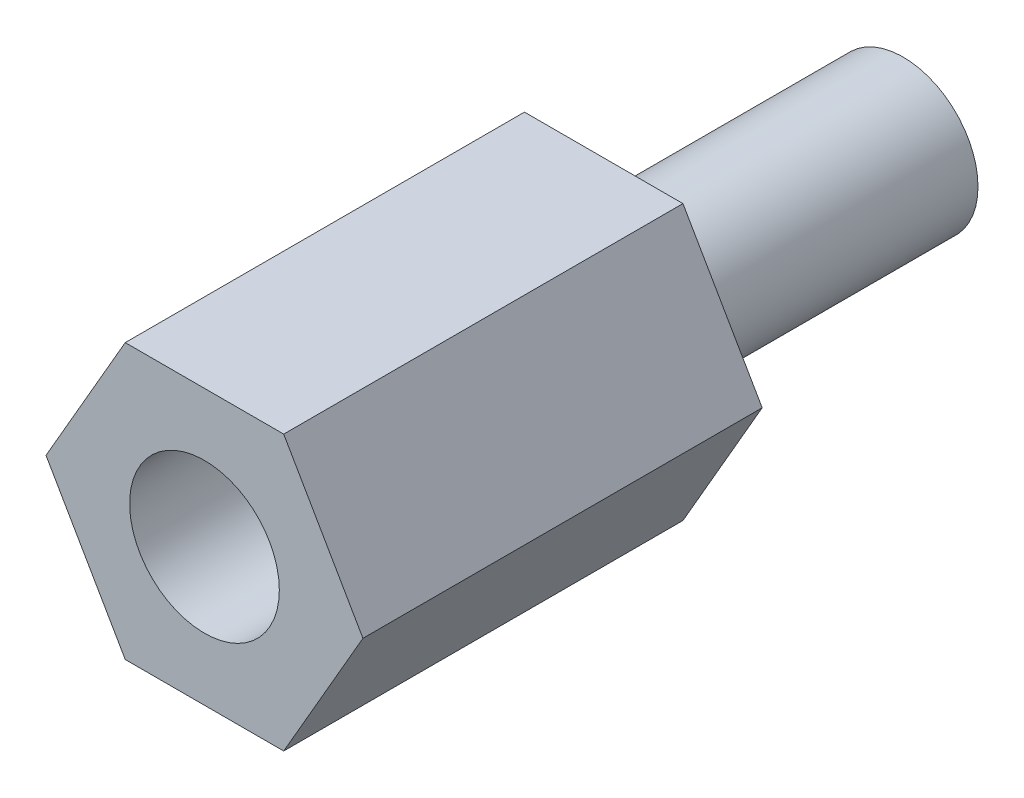
ISO-10303-21;
HEADER;
FILE_DESCRIPTION(('STEP AP214'),'2;1');
FILE_NAME('part.step','',(''),(''),'','','');
FILE_SCHEMA(('AUTOMOTIVE_DESIGN { 1 0 10303 214 1 1 1 1 }'));
ENDSEC;
DATA;
#1=APPLICATION_CONTEXT('core data for automotive mechanical design processes');
#2=APPLICATION_PROTOCOL_DEFINITION('international standard','automotive_design',2000,#1);
#3=PRODUCT_CONTEXT('',#1,'mechanical');
#4=PRODUCT('Part','Part','',(#3));
#5=PRODUCT_RELATED_PRODUCT_CATEGORY('part','',(#4));
#6=PRODUCT_DEFINITION_FORMATION('','',#4);
#7=PRODUCT_DEFINITION_CONTEXT('part definition',#1,'design');
#8=PRODUCT_DEFINITION('design','',#6,#7);
#9=PRODUCT_DEFINITION_SHAPE('','',#8);
#10=(LENGTH_UNIT() NAMED_UNIT(*) SI_UNIT(.MILLI.,.METRE.));
#11=(NAMED_UNIT(*) PLANE_ANGLE_UNIT() SI_UNIT($,.RADIAN.));
#12=(NAMED_UNIT(*) SI_UNIT($,.STERADIAN.) SOLID_ANGLE_UNIT());
#13=UNCERTAINTY_MEASURE_WITH_UNIT(LENGTH_MEASURE(1.E-05),#10,'distance_accuracy_value','');
#14=(GEOMETRIC_REPRESENTATION_CONTEXT(3) GLOBAL_UNCERTAINTY_ASSIGNED_CONTEXT((#13)) GLOBAL_UNIT_ASSIGNED_CONTEXT((#10,
#11,#12)) REPRESENTATION_CONTEXT('',''));
#15=CARTESIAN_POINT('',(0.,0.,0.));
#16=DIRECTION('',(0.,0.,1.));
#17=DIRECTION('',(1.,0.,0.));
#18=AXIS2_PLACEMENT_3D('',#15,#16,#17);
#19=CARTESIAN_POINT('',(3.17542648054294,0.,8.));
#20=DIRECTION('',(-0.866025403784439,-0.5,0.));
#21=DIRECTION('',(0.5,-0.866025403784439,0.));
#22=AXIS2_PLACEMENT_3D('',#19,#20,#21);
#23=PLANE('',#22);
#24=DIRECTION('',(-0.5,0.866025403784439,0.));
#25=VECTOR('',#24,1.);
#26=CARTESIAN_POINT('',(3.17542648054294,0.,0.));
#27=LINE('',#26,#25);
#28=CARTESIAN_POINT('',(3.17542648054294,0.,0.));
#29=VERTEX_POINT('',#28);
#30=CARTESIAN_POINT('',(1.58771324027147,2.75,0.));
#31=VERTEX_POINT('',#30);
#32=EDGE_CURVE('E133',#29,#31,#27,.T.);
#33=ORIENTED_EDGE('',*,*,#32,.T.);
#34=DIRECTION('',(0.,0.,-1.));
#35=VECTOR('',#34,1.);
#36=CARTESIAN_POINT('',(1.58771324027147,2.75,8.));
#37=LINE('',#36,#35);
#38=CARTESIAN_POINT('',(1.58771324027147,2.75,8.));
#39=VERTEX_POINT('',#38);
#40=EDGE_CURVE('E11',#39,#31,#37,.T.);
#41=ORIENTED_EDGE('',*,*,#40,.F.);
#42=DIRECTION('',(-0.5,0.866025403784439,0.));
#43=VECTOR('',#42,1.);
#44=CARTESIAN_POINT('',(3.17542648054294,0.,8.));
#45=LINE('',#44,#43);
#46=CARTESIAN_POINT('',(3.17542648054294,0.,8.));
#47=VERTEX_POINT('',#46);
#48=EDGE_CURVE('E151',#47,#39,#45,.T.);
#49=ORIENTED_EDGE('',*,*,#48,.F.);
#50=DIRECTION('',(0.,0.,-1.));
#51=VECTOR('',#50,1.);
#52=CARTESIAN_POINT('',(3.17542648054294,0.,8.));
#53=LINE('',#52,#51);
#54=EDGE_CURVE('E128',#47,#29,#53,.T.);
#55=ORIENTED_EDGE('',*,*,#54,.T.);
#56=EDGE_LOOP('',(#33,#41,#49,#55));
#57=FACE_BOUND('',#56,.T.);
#58=ADVANCED_FACE('F44',(#57),#23,.F.);
#59=CARTESIAN_POINT('',(1.58771324027147,2.75,8.));
#60=DIRECTION('',(0.,-1.,0.));
#61=DIRECTION('',(1.,0.,0.));
#62=AXIS2_PLACEMENT_3D('',#59,#60,#61);
#63=PLANE('',#62);
#64=DIRECTION('',(-1.,0.,0.));
#65=VECTOR('',#64,1.);
#66=CARTESIAN_POINT('',(1.58771324027147,2.75,0.));
#67=LINE('',#66,#65);
#68=CARTESIAN_POINT('',(-1.58771324027147,2.75,0.));
#69=VERTEX_POINT('',#68);
#70=EDGE_CURVE('E138',#31,#69,#67,.T.);
#71=ORIENTED_EDGE('',*,*,#70,.T.);
#72=DIRECTION('',(0.,0.,-1.));
#73=VECTOR('',#72,1.);
#74=CARTESIAN_POINT('',(-1.58771324027147,2.75,8.));
#75=LINE('',#74,#73);
#76=CARTESIAN_POINT('',(-1.58771324027147,2.75,8.));
#77=VERTEX_POINT('',#76);
#78=EDGE_CURVE('E53',#77,#69,#75,.T.);
#79=ORIENTED_EDGE('',*,*,#78,.F.);
#80=DIRECTION('',(-1.,0.,0.));
#81=VECTOR('',#80,1.);
#82=CARTESIAN_POINT('',(1.58771324027147,2.75,8.));
#83=LINE('',#82,#81);
#84=EDGE_CURVE('E97',#39,#77,#83,.T.);
#85=ORIENTED_EDGE('',*,*,#84,.F.);
#86=ORIENTED_EDGE('',*,*,#40,.T.);
#87=EDGE_LOOP('',(#71,#79,#85,#86));
#88=FACE_BOUND('',#87,.T.);
#89=ADVANCED_FACE('F182',(#88),#63,.F.);
#90=CARTESIAN_POINT('',(-1.58771324027147,2.75,8.));
#91=DIRECTION('',(0.866025403784439,-0.5,0.));
#92=DIRECTION('',(0.5,0.866025403784439,0.));
#93=AXIS2_PLACEMENT_3D('',#90,#91,#92);
#94=PLANE('',#93);
#95=DIRECTION('',(-0.5,-0.866025403784439,0.));
#96=VECTOR('',#95,1.);
#97=CARTESIAN_POINT('',(-1.58771324027147,2.75,0.));
#98=LINE('',#97,#96);
#99=CARTESIAN_POINT('',(-3.17542648054294,0.,0.));
#100=VERTEX_POINT('',#99);
#101=EDGE_CURVE('E142',#69,#100,#98,.T.);
#102=ORIENTED_EDGE('',*,*,#101,.T.);
#103=DIRECTION('',(0.,0.,-1.));
#104=VECTOR('',#103,1.);
#105=CARTESIAN_POINT('',(-3.17542648054294,0.,8.));
#106=LINE('',#105,#104);
#107=CARTESIAN_POINT('',(-3.17542648054294,0.,8.));
#108=VERTEX_POINT('',#107);
#109=EDGE_CURVE('E123',#108,#100,#106,.T.);
#110=ORIENTED_EDGE('',*,*,#109,.F.);
#111=DIRECTION('',(-0.5,-0.866025403784439,0.));
#112=VECTOR('',#111,1.);
#113=CARTESIAN_POINT('',(-1.58771324027147,2.75,8.));
#114=LINE('',#113,#112);
#115=EDGE_CURVE('E115',#77,#108,#114,.T.);
#116=ORIENTED_EDGE('',*,*,#115,.F.);
#117=ORIENTED_EDGE('',*,*,#78,.T.);
#118=EDGE_LOOP('',(#102,#110,#116,#117));
#119=FACE_BOUND('',#118,.T.);
#120=ADVANCED_FACE('F161',(#119),#94,.F.);
#121=CARTESIAN_POINT('',(-3.17542648054294,0.,8.));
#122=DIRECTION('',(0.866025403784438,0.5,0.));
#123=DIRECTION('',(-0.5,0.866025403784438,0.));
#124=AXIS2_PLACEMENT_3D('',#121,#122,#123);
#125=PLANE('',#124);
#126=DIRECTION('',(0.5,-0.866025403784438,0.));
#127=VECTOR('',#126,1.);
#128=CARTESIAN_POINT('',(-3.17542648054294,0.,0.));
#129=LINE('',#128,#127);
#130=CARTESIAN_POINT('',(-1.58771324027147,-2.75,0.));
#131=VERTEX_POINT('',#130);
#132=EDGE_CURVE('E121',#100,#131,#129,.T.);
#133=ORIENTED_EDGE('',*,*,#132,.T.);
#134=DIRECTION('',(0.,0.,-1.));
#135=VECTOR('',#134,1.);
#136=CARTESIAN_POINT('',(-1.58771324027147,-2.75,8.));
#137=LINE('',#136,#135);
#138=CARTESIAN_POINT('',(-1.58771324027147,-2.75,8.));
#139=VERTEX_POINT('',#138);
#140=EDGE_CURVE('E120',#139,#131,#137,.T.);
#141=ORIENTED_EDGE('',*,*,#140,.F.);
#142=DIRECTION('',(0.5,-0.866025403784438,0.));
#143=VECTOR('',#142,1.);
#144=CARTESIAN_POINT('',(-3.17542648054294,0.,8.));
#145=LINE('',#144,#143);
#146=EDGE_CURVE('E106',#108,#139,#145,.T.);
#147=ORIENTED_EDGE('',*,*,#146,.F.);
#148=ORIENTED_EDGE('',*,*,#109,.T.);
#149=EDGE_LOOP('',(#133,#141,#147,#148));
#150=FACE_BOUND('',#149,.T.);
#151=ADVANCED_FACE('F118',(#150),#125,.F.);
#152=CARTESIAN_POINT('',(-1.58771324027147,-2.75,8.));
#153=DIRECTION('',(0.,1.,0.));
#154=DIRECTION('',(-1.,0.,0.));
#155=AXIS2_PLACEMENT_3D('',#152,#153,#154);
#156=PLANE('',#155);
#157=DIRECTION('',(1.,0.,0.));
#158=VECTOR('',#157,1.);
#159=CARTESIAN_POINT('',(-1.58771324027147,-2.75,0.));
#160=LINE('',#159,#158);
#161=CARTESIAN_POINT('',(1.58771324027147,-2.75,0.));
#162=VERTEX_POINT('',#161);
#163=EDGE_CURVE('E84',#131,#162,#160,.T.);
#164=ORIENTED_EDGE('',*,*,#163,.T.);
#165=DIRECTION('',(0.,0.,-1.));
#166=VECTOR('',#165,1.);
#167=CARTESIAN_POINT('',(1.58771324027147,-2.75,8.));
#168=LINE('',#167,#166);
#169=CARTESIAN_POINT('',(1.58771324027147,-2.75,8.));
#170=VERTEX_POINT('',#169);
#171=EDGE_CURVE('E122',#170,#162,#168,.T.);
#172=ORIENTED_EDGE('',*,*,#171,.F.);
#173=DIRECTION('',(1.,0.,0.));
#174=VECTOR('',#173,1.);
#175=CARTESIAN_POINT('',(-1.58771324027147,-2.75,8.));
#176=LINE('',#175,#174);
#177=EDGE_CURVE('E109',#139,#170,#176,.T.);
#178=ORIENTED_EDGE('',*,*,#177,.F.);
#179=ORIENTED_EDGE('',*,*,#140,.T.);
#180=EDGE_LOOP('',(#164,#172,#178,#179));
#181=FACE_BOUND('',#180,.T.);
#182=ADVANCED_FACE('F127',(#181),#156,.F.);
#183=CARTESIAN_POINT('',(1.58771324027147,-2.75,8.));
#184=DIRECTION('',(-0.866025403784439,0.5,0.));
#185=DIRECTION('',(-0.5,-0.866025403784439,0.));
#186=AXIS2_PLACEMENT_3D('',#183,#184,#185);
#187=PLANE('',#186);
#188=DIRECTION('',(0.5,0.866025403784439,0.));
#189=VECTOR('',#188,1.);
#190=CARTESIAN_POINT('',(1.58771324027147,-2.75,0.));
#191=LINE('',#190,#189);
#192=EDGE_CURVE('E93',#162,#29,#191,.T.);
#193=ORIENTED_EDGE('',*,*,#192,.T.);
#194=ORIENTED_EDGE('',*,*,#54,.F.);
#195=DIRECTION('',(0.5,0.866025403784439,0.));
#196=VECTOR('',#195,1.);
#197=CARTESIAN_POINT('',(1.58771324027147,-2.75,8.));
#198=LINE('',#197,#196);
#199=EDGE_CURVE('E61',#170,#47,#198,.T.);
#200=ORIENTED_EDGE('',*,*,#199,.F.);
#201=ORIENTED_EDGE('',*,*,#171,.T.);
#202=EDGE_LOOP('',(#193,#194,#200,#201));
#203=FACE_BOUND('',#202,.T.);
#204=ADVANCED_FACE('F169',(#203),#187,.F.);
#205=CARTESIAN_POINT('',(0.,0.,8.));
#206=DIRECTION('',(0.,0.,1.));
#207=DIRECTION('',(1.,0.,0.));
#208=AXIS2_PLACEMENT_3D('',#205,#206,#207);
#209=PLANE('',#208);
#210=CARTESIAN_POINT('',(0.,0.,8.));
#211=DIRECTION('',(0.,0.,1.));
#212=DIRECTION('',(1.,0.,0.));
#213=AXIS2_PLACEMENT_3D('',#210,#211,#212);
#214=CIRCLE('',#213,1.5);
#215=CARTESIAN_POINT('',(1.5,0.,8.));
#216=VERTEX_POINT('',#215);
#217=EDGE_CURVE('E266',#216,#216,#214,.T.);
#218=ORIENTED_EDGE('',*,*,#217,.F.);
#219=EDGE_LOOP('',(#218));
#220=FACE_BOUND('',#219,.T.);
#221=ORIENTED_EDGE('',*,*,#48,.T.);
#222=ORIENTED_EDGE('',*,*,#84,.T.);
#223=ORIENTED_EDGE('',*,*,#115,.T.);
#224=ORIENTED_EDGE('',*,*,#146,.T.);
#225=ORIENTED_EDGE('',*,*,#177,.T.);
#226=ORIENTED_EDGE('',*,*,#199,.T.);
#227=EDGE_LOOP('',(#221,#222,#223,#224,#225,#226));
#228=FACE_BOUND('',#227,.T.);
#229=ADVANCED_FACE('F107',(#220,#228),#209,.T.);
#230=CARTESIAN_POINT('',(0.,0.,0.));
#231=DIRECTION('',(0.,0.,1.));
#232=DIRECTION('',(1.,0.,0.));
#233=AXIS2_PLACEMENT_3D('',#230,#231,#232);
#234=PLANE('',#233);
#235=CARTESIAN_POINT('',(0.,0.,0.));
#236=DIRECTION('',(0.,0.,1.));
#237=DIRECTION('',(1.,0.,0.));
#238=AXIS2_PLACEMENT_3D('',#235,#236,#237);
#239=CIRCLE('',#238,1.5);
#240=CARTESIAN_POINT('',(1.5,0.,0.));
#241=VERTEX_POINT('',#240);
#242=EDGE_CURVE('E264',#241,#241,#239,.T.);
#243=ORIENTED_EDGE('',*,*,#242,.T.);
#244=EDGE_LOOP('',(#243));
#245=FACE_BOUND('',#244,.T.);
#246=ORIENTED_EDGE('',*,*,#32,.F.);
#247=ORIENTED_EDGE('',*,*,#192,.F.);
#248=ORIENTED_EDGE('',*,*,#163,.F.);
#249=ORIENTED_EDGE('',*,*,#132,.F.);
#250=ORIENTED_EDGE('',*,*,#101,.F.);
#251=ORIENTED_EDGE('',*,*,#70,.F.);
#252=EDGE_LOOP('',(#246,#247,#248,#249,#250,#251));
#253=FACE_BOUND('',#252,.T.);
#254=ADVANCED_FACE('F163',(#245,#253),#234,.F.);
#255=CARTESIAN_POINT('',(0.,0.,-6.));
#256=DIRECTION('',(0.,0.,1.));
#257=DIRECTION('',(1.,0.,0.));
#258=AXIS2_PLACEMENT_3D('',#255,#256,#257);
#259=CYLINDRICAL_SURFACE('',#258,1.5);
#260=CARTESIAN_POINT('',(0.,0.,-6.));
#261=DIRECTION('',(0.,0.,1.));
#262=DIRECTION('',(1.,0.,0.));
#263=AXIS2_PLACEMENT_3D('',#260,#261,#262);
#264=CIRCLE('',#263,1.5);
#265=CARTESIAN_POINT('',(1.5,0.,-6.));
#266=VERTEX_POINT('',#265);
#267=EDGE_CURVE('E137',#266,#266,#264,.T.);
#268=ORIENTED_EDGE('',*,*,#267,.T.);
#269=EDGE_LOOP('',(#268));
#270=FACE_BOUND('',#269,.T.);
#271=ORIENTED_EDGE('',*,*,#242,.F.);
#272=EDGE_LOOP('',(#271));
#273=FACE_BOUND('',#272,.T.);
#274=ADVANCED_FACE('F222',(#270,#273),#259,.T.);
#275=CARTESIAN_POINT('',(0.,0.,-6.));
#276=DIRECTION('',(0.,0.,1.));
#277=DIRECTION('',(1.,0.,0.));
#278=AXIS2_PLACEMENT_3D('',#275,#276,#277);
#279=PLANE('',#278);
#280=ORIENTED_EDGE('',*,*,#267,.F.);
#281=EDGE_LOOP('',(#280));
#282=FACE_BOUND('',#281,.T.);
#283=ADVANCED_FACE('F227',(#282),#279,.F.);
#284=CARTESIAN_POINT('',(0.,0.,2.));
#285=DIRECTION('',(0.,0.,1.));
#286=DIRECTION('',(1.,0.,0.));
#287=AXIS2_PLACEMENT_3D('',#284,#285,#286);
#288=CYLINDRICAL_SURFACE('',#287,1.5);
#289=CARTESIAN_POINT('',(0.,0.,2.));
#290=DIRECTION('',(0.,0.,1.));
#291=DIRECTION('',(1.,0.,0.));
#292=AXIS2_PLACEMENT_3D('',#289,#290,#291);
#293=CIRCLE('',#292,1.5);
#294=CARTESIAN_POINT('',(1.5,0.,2.));
#295=VERTEX_POINT('',#294);
#296=EDGE_CURVE('E263',#295,#295,#293,.T.);
#297=ORIENTED_EDGE('',*,*,#296,.F.);
#298=EDGE_LOOP('',(#297));
#299=FACE_BOUND('',#298,.T.);
#300=ORIENTED_EDGE('',*,*,#217,.T.);
#301=EDGE_LOOP('',(#300));
#302=FACE_BOUND('',#301,.T.);
#303=ADVANCED_FACE('F239',(#299,#302),#288,.F.);
#304=CARTESIAN_POINT('',(0.,0.,2.));
#305=DIRECTION('',(0.,0.,1.));
#306=DIRECTION('',(1.,0.,0.));
#307=AXIS2_PLACEMENT_3D('',#304,#305,#306);
#308=PLANE('',#307);
#309=ORIENTED_EDGE('',*,*,#296,.T.);
#310=EDGE_LOOP('',(#309));
#311=FACE_BOUND('',#310,.T.);
#312=ADVANCED_FACE('F248',(#311),#308,.T.);
#313=CLOSED_SHELL('',(#58,#89,#120,#151,#182,#204,#229,#254,#274,#283,#303,#312));
#314=MANIFOLD_SOLID_BREP('B2',#313);
#315=ADVANCED_BREP_SHAPE_REPRESENTATION('',(#18,#314),#14);
#316=SHAPE_DEFINITION_REPRESENTATION(#9,#315);
ENDSEC;
END-ISO-10303-21;
